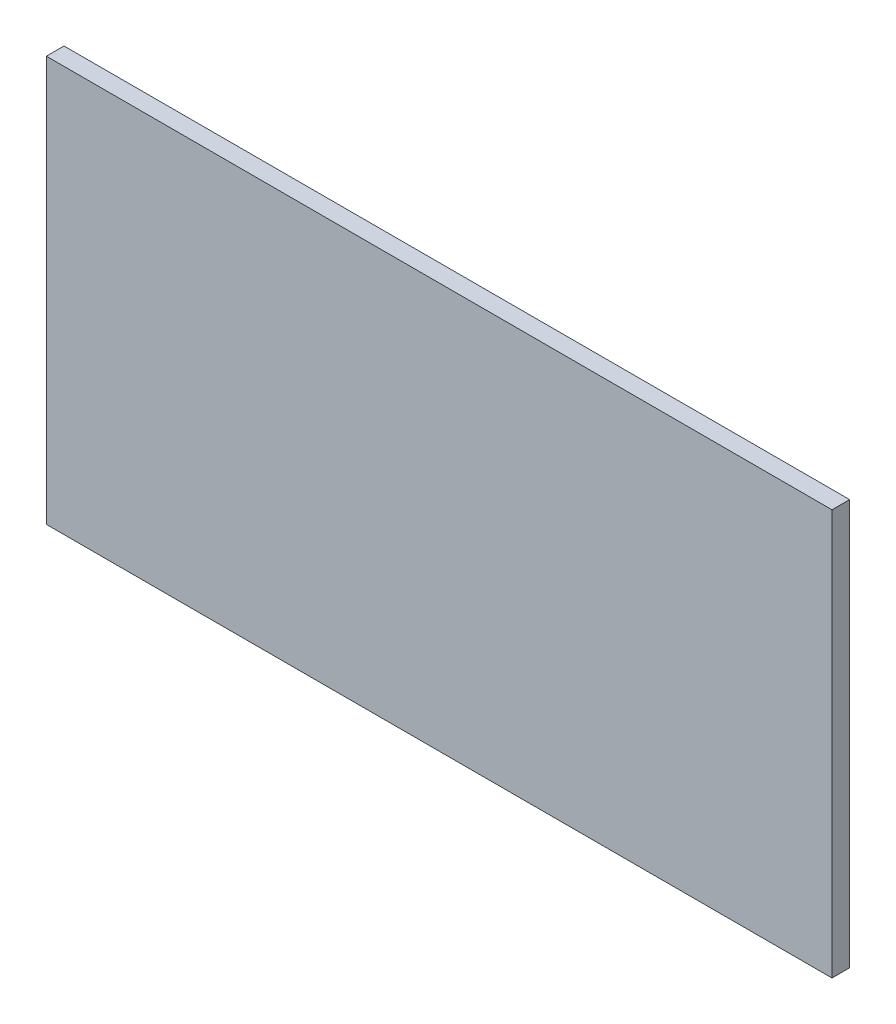
ISO-10303-21;
HEADER;
FILE_DESCRIPTION(('STEP AP214'),'2;1');
FILE_NAME('part.step','',(''),(''),'','','');
FILE_SCHEMA(('AUTOMOTIVE_DESIGN { 1 0 10303 214 1 1 1 1 }'));
ENDSEC;
DATA;
#1=APPLICATION_CONTEXT('core data for automotive mechanical design processes');
#2=APPLICATION_PROTOCOL_DEFINITION('international standard','automotive_design',2000,#1);
#3=PRODUCT_CONTEXT('',#1,'mechanical');
#4=PRODUCT('Part','Part','',(#3));
#5=PRODUCT_RELATED_PRODUCT_CATEGORY('part','',(#4));
#6=PRODUCT_DEFINITION_FORMATION('','',#4);
#7=PRODUCT_DEFINITION_CONTEXT('part definition',#1,'design');
#8=PRODUCT_DEFINITION('design','',#6,#7);
#9=PRODUCT_DEFINITION_SHAPE('','',#8);
#10=(LENGTH_UNIT() NAMED_UNIT(*) SI_UNIT(.MILLI.,.METRE.));
#11=(NAMED_UNIT(*) PLANE_ANGLE_UNIT() SI_UNIT($,.RADIAN.));
#12=(NAMED_UNIT(*) SI_UNIT($,.STERADIAN.) SOLID_ANGLE_UNIT());
#13=UNCERTAINTY_MEASURE_WITH_UNIT(LENGTH_MEASURE(1.E-05),#10,'distance_accuracy_value','');
#14=(GEOMETRIC_REPRESENTATION_CONTEXT(3) GLOBAL_UNCERTAINTY_ASSIGNED_CONTEXT((#13)) GLOBAL_UNIT_ASSIGNED_CONTEXT((#10,
#11,#12)) REPRESENTATION_CONTEXT('',''));
#15=CARTESIAN_POINT('',(0.,0.,0.));
#16=DIRECTION('',(0.,0.,1.));
#17=DIRECTION('',(1.,0.,0.));
#18=AXIS2_PLACEMENT_3D('',#15,#16,#17);
#19=CARTESIAN_POINT('',(-356.5,-184.,16.));
#20=DIRECTION('',(1.,0.,0.));
#21=DIRECTION('',(0.,0.,-1.));
#22=AXIS2_PLACEMENT_3D('',#19,#20,#21);
#23=PLANE('',#22);
#24=DIRECTION('',(0.,-1.,0.));
#25=VECTOR('',#24,1.);
#26=CARTESIAN_POINT('',(-356.5,-184.,0.));
#27=LINE('',#26,#25);
#28=CARTESIAN_POINT('',(-356.5,184.,0.));
#29=VERTEX_POINT('',#28);
#30=CARTESIAN_POINT('',(-356.5,-184.,0.));
#31=VERTEX_POINT('',#30);
#32=EDGE_CURVE('E98',#29,#31,#27,.T.);
#33=ORIENTED_EDGE('',*,*,#32,.T.);
#34=DIRECTION('',(0.,0.,-1.));
#35=VECTOR('',#34,1.);
#36=CARTESIAN_POINT('',(-356.5,-184.,16.));
#37=LINE('',#36,#35);
#38=CARTESIAN_POINT('',(-356.5,-184.,16.));
#39=VERTEX_POINT('',#38);
#40=EDGE_CURVE('E11',#39,#31,#37,.T.);
#41=ORIENTED_EDGE('',*,*,#40,.F.);
#42=DIRECTION('',(0.,-1.,0.));
#43=VECTOR('',#42,1.);
#44=CARTESIAN_POINT('',(-356.5,-184.,16.));
#45=LINE('',#44,#43);
#46=CARTESIAN_POINT('',(-356.5,184.,16.));
#47=VERTEX_POINT('',#46);
#48=EDGE_CURVE('E86',#47,#39,#45,.T.);
#49=ORIENTED_EDGE('',*,*,#48,.F.);
#50=DIRECTION('',(0.,0.,-1.));
#51=VECTOR('',#50,1.);
#52=CARTESIAN_POINT('',(-356.5,184.,16.));
#53=LINE('',#52,#51);
#54=EDGE_CURVE('E94',#47,#29,#53,.T.);
#55=ORIENTED_EDGE('',*,*,#54,.T.);
#56=EDGE_LOOP('',(#33,#41,#49,#55));
#57=FACE_BOUND('',#56,.T.);
#58=ADVANCED_FACE('F35',(#57),#23,.F.);
#59=CARTESIAN_POINT('',(356.5,-184.,16.));
#60=DIRECTION('',(0.,1.,0.));
#61=DIRECTION('',(-1.,0.,0.));
#62=AXIS2_PLACEMENT_3D('',#59,#60,#61);
#63=PLANE('',#62);
#64=DIRECTION('',(1.,0.,0.));
#65=VECTOR('',#64,1.);
#66=CARTESIAN_POINT('',(356.5,-184.,0.));
#67=LINE('',#66,#65);
#68=CARTESIAN_POINT('',(356.5,-184.,0.));
#69=VERTEX_POINT('',#68);
#70=EDGE_CURVE('E90',#31,#69,#67,.T.);
#71=ORIENTED_EDGE('',*,*,#70,.T.);
#72=DIRECTION('',(0.,0.,-1.));
#73=VECTOR('',#72,1.);
#74=CARTESIAN_POINT('',(356.5,-184.,16.));
#75=LINE('',#74,#73);
#76=CARTESIAN_POINT('',(356.5,-184.,16.));
#77=VERTEX_POINT('',#76);
#78=EDGE_CURVE('E43',#77,#69,#75,.T.);
#79=ORIENTED_EDGE('',*,*,#78,.F.);
#80=DIRECTION('',(1.,0.,0.));
#81=VECTOR('',#80,1.);
#82=CARTESIAN_POINT('',(356.5,-184.,16.));
#83=LINE('',#82,#81);
#84=EDGE_CURVE('E81',#39,#77,#83,.T.);
#85=ORIENTED_EDGE('',*,*,#84,.F.);
#86=ORIENTED_EDGE('',*,*,#40,.T.);
#87=EDGE_LOOP('',(#71,#79,#85,#86));
#88=FACE_BOUND('',#87,.T.);
#89=ADVANCED_FACE('F89',(#88),#63,.F.);
#90=CARTESIAN_POINT('',(356.5,-184.,16.));
#91=DIRECTION('',(-1.,0.,0.));
#92=DIRECTION('',(0.,0.,1.));
#93=AXIS2_PLACEMENT_3D('',#90,#91,#92);
#94=PLANE('',#93);
#95=DIRECTION('',(0.,1.,0.));
#96=VECTOR('',#95,1.);
#97=CARTESIAN_POINT('',(356.5,-184.,0.));
#98=LINE('',#97,#96);
#99=CARTESIAN_POINT('',(356.5,184.,0.));
#100=VERTEX_POINT('',#99);
#101=EDGE_CURVE('E68',#69,#100,#98,.T.);
#102=ORIENTED_EDGE('',*,*,#101,.T.);
#103=DIRECTION('',(0.,0.,-1.));
#104=VECTOR('',#103,1.);
#105=CARTESIAN_POINT('',(356.5,184.,16.));
#106=LINE('',#105,#104);
#107=CARTESIAN_POINT('',(356.5,184.,16.));
#108=VERTEX_POINT('',#107);
#109=EDGE_CURVE('E91',#108,#100,#106,.T.);
#110=ORIENTED_EDGE('',*,*,#109,.F.);
#111=DIRECTION('',(0.,1.,0.));
#112=VECTOR('',#111,1.);
#113=CARTESIAN_POINT('',(356.5,-184.,16.));
#114=LINE('',#113,#112);
#115=EDGE_CURVE('E84',#77,#108,#114,.T.);
#116=ORIENTED_EDGE('',*,*,#115,.F.);
#117=ORIENTED_EDGE('',*,*,#78,.T.);
#118=EDGE_LOOP('',(#102,#110,#116,#117));
#119=FACE_BOUND('',#118,.T.);
#120=ADVANCED_FACE('F92',(#119),#94,.F.);
#121=CARTESIAN_POINT('',(356.5,184.,16.));
#122=DIRECTION('',(0.,-1.,0.));
#123=DIRECTION('',(1.,0.,0.));
#124=AXIS2_PLACEMENT_3D('',#121,#122,#123);
#125=PLANE('',#124);
#126=DIRECTION('',(-1.,0.,0.));
#127=VECTOR('',#126,1.);
#128=CARTESIAN_POINT('',(356.5,184.,0.));
#129=LINE('',#128,#127);
#130=EDGE_CURVE('E74',#100,#29,#129,.T.);
#131=ORIENTED_EDGE('',*,*,#130,.T.);
#132=ORIENTED_EDGE('',*,*,#54,.F.);
#133=DIRECTION('',(-1.,0.,0.));
#134=VECTOR('',#133,1.);
#135=CARTESIAN_POINT('',(356.5,184.,16.));
#136=LINE('',#135,#134);
#137=EDGE_CURVE('E51',#108,#47,#136,.T.);
#138=ORIENTED_EDGE('',*,*,#137,.F.);
#139=ORIENTED_EDGE('',*,*,#109,.T.);
#140=EDGE_LOOP('',(#131,#132,#138,#139));
#141=FACE_BOUND('',#140,.T.);
#142=ADVANCED_FACE('F105',(#141),#125,.F.);
#143=CARTESIAN_POINT('',(0.,0.,16.));
#144=DIRECTION('',(0.,0.,1.));
#145=DIRECTION('',(1.,0.,0.));
#146=AXIS2_PLACEMENT_3D('',#143,#144,#145);
#147=PLANE('',#146);
#148=ORIENTED_EDGE('',*,*,#48,.T.);
#149=ORIENTED_EDGE('',*,*,#84,.T.);
#150=ORIENTED_EDGE('',*,*,#115,.T.);
#151=ORIENTED_EDGE('',*,*,#137,.T.);
#152=EDGE_LOOP('',(#148,#149,#150,#151));
#153=FACE_BOUND('',#152,.T.);
#154=ADVANCED_FACE('F82',(#153),#147,.T.);
#155=CARTESIAN_POINT('',(0.,0.,0.));
#156=DIRECTION('',(0.,0.,1.));
#157=DIRECTION('',(1.,0.,0.));
#158=AXIS2_PLACEMENT_3D('',#155,#156,#157);
#159=PLANE('',#158);
#160=ORIENTED_EDGE('',*,*,#32,.F.);
#161=ORIENTED_EDGE('',*,*,#130,.F.);
#162=ORIENTED_EDGE('',*,*,#101,.F.);
#163=ORIENTED_EDGE('',*,*,#70,.F.);
#164=EDGE_LOOP('',(#160,#161,#162,#163));
#165=FACE_BOUND('',#164,.T.);
#166=ADVANCED_FACE('F108',(#165),#159,.F.);
#167=CLOSED_SHELL('',(#58,#89,#120,#142,#154,#166));
#168=MANIFOLD_SOLID_BREP('B2',#167);
#169=ADVANCED_BREP_SHAPE_REPRESENTATION('',(#18,#168),#14);
#170=SHAPE_DEFINITION_REPRESENTATION(#9,#169);
ENDSEC;
END-ISO-10303-21;
